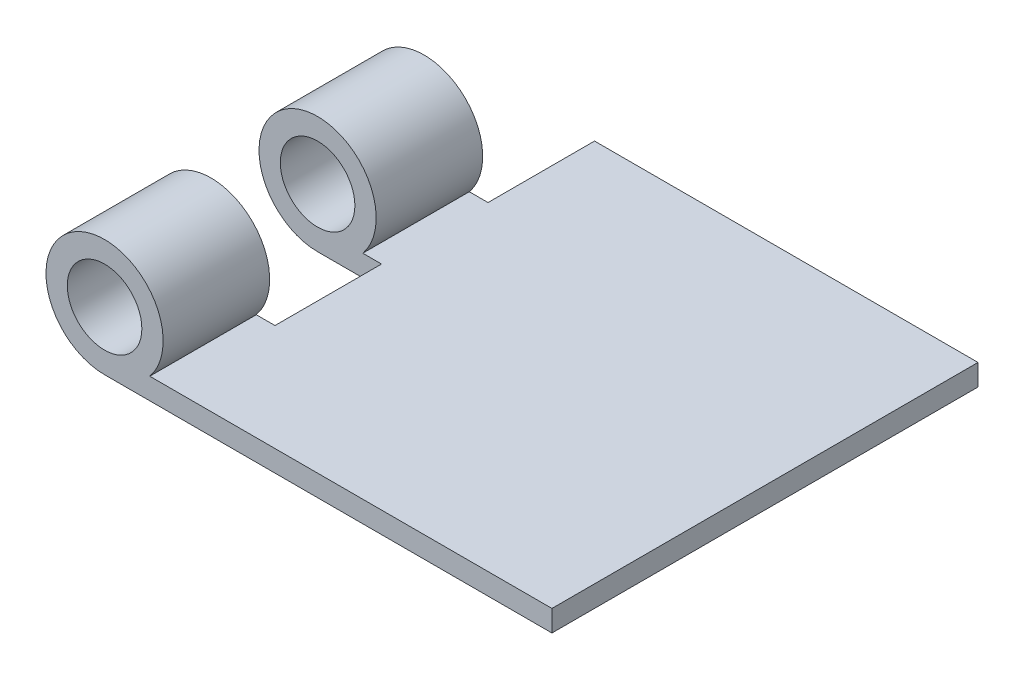
ISO-10303-21;
HEADER;
FILE_DESCRIPTION(('STEP AP214'),'2;1');
FILE_NAME('part.step','',(''),(''),'','','');
FILE_SCHEMA(('AUTOMOTIVE_DESIGN { 1 0 10303 214 1 1 1 1 }'));
ENDSEC;
DATA;
#1=APPLICATION_CONTEXT('core data for automotive mechanical design processes');
#2=APPLICATION_PROTOCOL_DEFINITION('international standard','automotive_design',2000,#1);
#3=PRODUCT_CONTEXT('',#1,'mechanical');
#4=PRODUCT('Part','Part','',(#3));
#5=PRODUCT_RELATED_PRODUCT_CATEGORY('part','',(#4));
#6=PRODUCT_DEFINITION_FORMATION('','',#4);
#7=PRODUCT_DEFINITION_CONTEXT('part definition',#1,'design');
#8=PRODUCT_DEFINITION('design','',#6,#7);
#9=PRODUCT_DEFINITION_SHAPE('','',#8);
#10=(LENGTH_UNIT() NAMED_UNIT(*) SI_UNIT(.MILLI.,.METRE.));
#11=(NAMED_UNIT(*) PLANE_ANGLE_UNIT() SI_UNIT($,.RADIAN.));
#12=(NAMED_UNIT(*) SI_UNIT($,.STERADIAN.) SOLID_ANGLE_UNIT());
#13=UNCERTAINTY_MEASURE_WITH_UNIT(LENGTH_MEASURE(1.E-05),#10,'distance_accuracy_value','');
#14=(GEOMETRIC_REPRESENTATION_CONTEXT(3) GLOBAL_UNCERTAINTY_ASSIGNED_CONTEXT((#13)) GLOBAL_UNIT_ASSIGNED_CONTEXT((#10,
#11,#12)) REPRESENTATION_CONTEXT('',''));
#15=CARTESIAN_POINT('',(0.,0.,0.));
#16=DIRECTION('',(0.,0.,1.));
#17=DIRECTION('',(1.,0.,0.));
#18=AXIS2_PLACEMENT_3D('',#15,#16,#17);
#19=CARTESIAN_POINT('',(18.,-1.,-10.));
#20=DIRECTION('',(0.,0.,-1.));
#21=DIRECTION('',(-1.,0.,0.));
#22=AXIS2_PLACEMENT_3D('',#19,#20,#21);
#23=PLANE('',#22);
#24=DIRECTION('',(-1.,0.,0.));
#25=VECTOR('',#24,1.);
#26=CARTESIAN_POINT('',(18.,0.,-10.));
#27=LINE('',#26,#25);
#28=CARTESIAN_POINT('',(36.,0.,-10.));
#29=VERTEX_POINT('',#28);
#30=CARTESIAN_POINT('',(18.,0.,-10.));
#31=VERTEX_POINT('',#30);
#32=EDGE_CURVE('E147',#29,#31,#27,.T.);
#33=ORIENTED_EDGE('',*,*,#32,.F.);
#34=DIRECTION('',(0.,1.,0.));
#35=VECTOR('',#34,1.);
#36=CARTESIAN_POINT('',(36.,-1.,-10.));
#37=LINE('',#36,#35);
#38=CARTESIAN_POINT('',(36.,-1.,-10.));
#39=VERTEX_POINT('',#38);
#40=EDGE_CURVE('E191',#39,#29,#37,.T.);
#41=ORIENTED_EDGE('',*,*,#40,.F.);
#42=DIRECTION('',(-1.,0.,0.));
#43=VECTOR('',#42,1.);
#44=CARTESIAN_POINT('',(18.,-1.,-10.));
#45=LINE('',#44,#43);
#46=CARTESIAN_POINT('',(18.,-1.,-10.));
#47=VERTEX_POINT('',#46);
#48=EDGE_CURVE('E150',#39,#47,#45,.T.);
#49=ORIENTED_EDGE('',*,*,#48,.T.);
#50=DIRECTION('',(0.,1.,0.));
#51=VECTOR('',#50,1.);
#52=CARTESIAN_POINT('',(18.,-1.,-10.));
#53=LINE('',#52,#51);
#54=EDGE_CURVE('E178',#47,#31,#53,.T.);
#55=ORIENTED_EDGE('',*,*,#54,.T.);
#56=EDGE_LOOP('',(#33,#41,#49,#55));
#57=FACE_BOUND('',#56,.T.);
#58=ADVANCED_FACE('F36',(#57),#23,.T.);
#59=CARTESIAN_POINT('',(36.,-1.,-10.));
#60=DIRECTION('',(1.,0.,0.));
#61=DIRECTION('',(0.,0.,-1.));
#62=AXIS2_PLACEMENT_3D('',#59,#60,#61);
#63=PLANE('',#62);
#64=DIRECTION('',(0.,0.,-1.));
#65=VECTOR('',#64,1.);
#66=CARTESIAN_POINT('',(36.,0.,-10.));
#67=LINE('',#66,#65);
#68=CARTESIAN_POINT('',(36.,0.,9.99999999999999));
#69=VERTEX_POINT('',#68);
#70=EDGE_CURVE('E154',#69,#29,#67,.T.);
#71=ORIENTED_EDGE('',*,*,#70,.F.);
#72=DIRECTION('',(0.,1.,0.));
#73=VECTOR('',#72,1.);
#74=CARTESIAN_POINT('',(36.,-1.,9.99999999999999));
#75=LINE('',#74,#73);
#76=CARTESIAN_POINT('',(36.,-1.,9.99999999999999));
#77=VERTEX_POINT('',#76);
#78=EDGE_CURVE('E193',#77,#69,#75,.T.);
#79=ORIENTED_EDGE('',*,*,#78,.F.);
#80=DIRECTION('',(0.,0.,-1.));
#81=VECTOR('',#80,1.);
#82=CARTESIAN_POINT('',(36.,-1.,-10.));
#83=LINE('',#82,#81);
#84=EDGE_CURVE('E175',#77,#39,#83,.T.);
#85=ORIENTED_EDGE('',*,*,#84,.T.);
#86=ORIENTED_EDGE('',*,*,#40,.T.);
#87=EDGE_LOOP('',(#71,#79,#85,#86));
#88=FACE_BOUND('',#87,.T.);
#89=ADVANCED_FACE('F210',(#88),#63,.T.);
#90=CARTESIAN_POINT('',(36.,-1.,9.99999999999999));
#91=DIRECTION('',(0.,0.,1.));
#92=DIRECTION('',(1.,0.,0.));
#93=AXIS2_PLACEMENT_3D('',#90,#91,#92);
#94=PLANE('',#93);
#95=DIRECTION('',(1.,0.,0.));
#96=VECTOR('',#95,1.);
#97=CARTESIAN_POINT('',(36.,0.,9.99999999999999));
#98=LINE('',#97,#96);
#99=CARTESIAN_POINT('',(17.1213203435596,0.,9.99999999999999));
#100=VERTEX_POINT('',#99);
#101=EDGE_CURVE('E187',#100,#69,#98,.T.);
#102=ORIENTED_EDGE('',*,*,#101,.F.);
#103=CARTESIAN_POINT('',(15.,1.75,10.));
#104=DIRECTION('',(0.,0.,1.));
#105=DIRECTION('',(1.,0.,0.));
#106=AXIS2_PLACEMENT_3D('',#103,#104,#105);
#107=CIRCLE('',#106,2.75);
#108=CARTESIAN_POINT('',(15.,-1.,10.));
#109=VERTEX_POINT('',#108);
#110=EDGE_CURVE('E137',#100,#109,#107,.T.);
#111=ORIENTED_EDGE('',*,*,#110,.T.);
#112=DIRECTION('',(1.,0.,0.));
#113=VECTOR('',#112,1.);
#114=CARTESIAN_POINT('',(36.,-1.,9.99999999999999));
#115=LINE('',#114,#113);
#116=EDGE_CURVE('E172',#109,#77,#115,.T.);
#117=ORIENTED_EDGE('',*,*,#116,.T.);
#118=ORIENTED_EDGE('',*,*,#78,.T.);
#119=EDGE_LOOP('',(#102,#111,#117,#118));
#120=FACE_BOUND('',#119,.T.);
#121=CARTESIAN_POINT('',(15.,1.75,10.));
#122=DIRECTION('',(0.,0.,1.));
#123=DIRECTION('',(1.,0.,0.));
#124=AXIS2_PLACEMENT_3D('',#121,#122,#123);
#125=CIRCLE('',#124,1.75);
#126=CARTESIAN_POINT('',(16.75,1.75,10.));
#127=VERTEX_POINT('',#126);
#128=EDGE_CURVE('E141',#127,#127,#125,.T.);
#129=ORIENTED_EDGE('',*,*,#128,.F.);
#130=EDGE_LOOP('',(#129));
#131=FACE_BOUND('',#130,.T.);
#132=ADVANCED_FACE('F235',(#120,#131),#94,.T.);
#133=CARTESIAN_POINT('',(18.,-1.,4.99999999999999));
#134=DIRECTION('',(0.,0.,-1.));
#135=DIRECTION('',(-1.,0.,0.));
#136=AXIS2_PLACEMENT_3D('',#133,#134,#135);
#137=PLANE('',#136);
#138=CARTESIAN_POINT('',(15.,1.75,4.99999999999999));
#139=DIRECTION('',(0.,0.,-1.));
#140=DIRECTION('',(-1.,0.,0.));
#141=AXIS2_PLACEMENT_3D('',#138,#139,#140);
#142=CIRCLE('',#141,1.75);
#143=CARTESIAN_POINT('',(13.25,1.75,4.99999999999999));
#144=VERTEX_POINT('',#143);
#145=EDGE_CURVE('E140',#144,#144,#142,.F.);
#146=ORIENTED_EDGE('',*,*,#145,.T.);
#147=EDGE_LOOP('',(#146));
#148=FACE_BOUND('',#147,.T.);
#149=DIRECTION('',(-1.,0.,0.));
#150=VECTOR('',#149,1.);
#151=CARTESIAN_POINT('',(18.,-1.,4.99999999999999));
#152=LINE('',#151,#150);
#153=CARTESIAN_POINT('',(18.,-1.,4.99999999999999));
#154=VERTEX_POINT('',#153);
#155=CARTESIAN_POINT('',(15.,-1.,4.99999999999999));
#156=VERTEX_POINT('',#155);
#157=EDGE_CURVE('E166',#154,#156,#152,.T.);
#158=ORIENTED_EDGE('',*,*,#157,.T.);
#159=CARTESIAN_POINT('',(15.,1.75,4.99999999999999));
#160=DIRECTION('',(0.,0.,-1.));
#161=DIRECTION('',(-1.,0.,0.));
#162=AXIS2_PLACEMENT_3D('',#159,#160,#161);
#163=CIRCLE('',#162,2.75);
#164=CARTESIAN_POINT('',(17.1213203435596,0.,4.99999999999999));
#165=VERTEX_POINT('',#164);
#166=EDGE_CURVE('E144',#165,#156,#163,.F.);
#167=ORIENTED_EDGE('',*,*,#166,.F.);
#168=DIRECTION('',(-1.,0.,0.));
#169=VECTOR('',#168,1.);
#170=CARTESIAN_POINT('',(18.,0.,4.99999999999999));
#171=LINE('',#170,#169);
#172=CARTESIAN_POINT('',(18.,0.,4.99999999999999));
#173=VERTEX_POINT('',#172);
#174=EDGE_CURVE('E185',#173,#165,#171,.T.);
#175=ORIENTED_EDGE('',*,*,#174,.F.);
#176=DIRECTION('',(0.,1.,0.));
#177=VECTOR('',#176,1.);
#178=CARTESIAN_POINT('',(18.,-1.,4.99999999999999));
#179=LINE('',#178,#177);
#180=EDGE_CURVE('E196',#154,#173,#179,.T.);
#181=ORIENTED_EDGE('',*,*,#180,.F.);
#182=EDGE_LOOP('',(#158,#167,#175,#181));
#183=FACE_BOUND('',#182,.T.);
#184=ADVANCED_FACE('F240',(#148,#183),#137,.T.);
#185=CARTESIAN_POINT('',(18.,-1.,0.));
#186=DIRECTION('',(-1.,0.,0.));
#187=DIRECTION('',(0.,0.,1.));
#188=AXIS2_PLACEMENT_3D('',#185,#186,#187);
#189=PLANE('',#188);
#190=DIRECTION('',(0.,0.,1.));
#191=VECTOR('',#190,1.);
#192=CARTESIAN_POINT('',(18.,0.,0.));
#193=LINE('',#192,#191);
#194=CARTESIAN_POINT('',(18.,0.,0.));
#195=VERTEX_POINT('',#194);
#196=EDGE_CURVE('E120',#195,#173,#193,.T.);
#197=ORIENTED_EDGE('',*,*,#196,.F.);
#198=DIRECTION('',(0.,1.,0.));
#199=VECTOR('',#198,1.);
#200=CARTESIAN_POINT('',(18.,-1.,0.));
#201=LINE('',#200,#199);
#202=CARTESIAN_POINT('',(18.,-1.,0.));
#203=VERTEX_POINT('',#202);
#204=EDGE_CURVE('E117',#203,#195,#201,.T.);
#205=ORIENTED_EDGE('',*,*,#204,.F.);
#206=DIRECTION('',(0.,0.,1.));
#207=VECTOR('',#206,1.);
#208=CARTESIAN_POINT('',(18.,-1.,0.));
#209=LINE('',#208,#207);
#210=EDGE_CURVE('E163',#203,#154,#209,.T.);
#211=ORIENTED_EDGE('',*,*,#210,.T.);
#212=ORIENTED_EDGE('',*,*,#180,.T.);
#213=EDGE_LOOP('',(#197,#205,#211,#212));
#214=FACE_BOUND('',#213,.T.);
#215=ADVANCED_FACE('F248',(#214),#189,.T.);
#216=CARTESIAN_POINT('',(15.,-1.,0.));
#217=DIRECTION('',(0.,0.,1.));
#218=DIRECTION('',(1.,0.,0.));
#219=AXIS2_PLACEMENT_3D('',#216,#217,#218);
#220=PLANE('',#219);
#221=DIRECTION('',(1.,0.,0.));
#222=VECTOR('',#221,1.);
#223=CARTESIAN_POINT('',(15.,0.,0.));
#224=LINE('',#223,#222);
#225=CARTESIAN_POINT('',(17.1213203435596,0.,0.));
#226=VERTEX_POINT('',#225);
#227=EDGE_CURVE('E111',#226,#195,#224,.T.);
#228=ORIENTED_EDGE('',*,*,#227,.F.);
#229=CARTESIAN_POINT('',(15.,1.75,0.));
#230=DIRECTION('',(0.,0.,1.));
#231=DIRECTION('',(1.,0.,0.));
#232=AXIS2_PLACEMENT_3D('',#229,#230,#231);
#233=CIRCLE('',#232,2.75);
#234=CARTESIAN_POINT('',(15.,-1.,0.));
#235=VERTEX_POINT('',#234);
#236=EDGE_CURVE('E116',#235,#226,#233,.F.);
#237=ORIENTED_EDGE('',*,*,#236,.F.);
#238=DIRECTION('',(1.,0.,0.));
#239=VECTOR('',#238,1.);
#240=CARTESIAN_POINT('',(15.,-1.,0.));
#241=LINE('',#240,#239);
#242=EDGE_CURVE('E161',#235,#203,#241,.T.);
#243=ORIENTED_EDGE('',*,*,#242,.T.);
#244=ORIENTED_EDGE('',*,*,#204,.T.);
#245=EDGE_LOOP('',(#228,#237,#243,#244));
#246=FACE_BOUND('',#245,.T.);
#247=CARTESIAN_POINT('',(15.,1.75,0.));
#248=DIRECTION('',(0.,0.,1.));
#249=DIRECTION('',(1.,0.,0.));
#250=AXIS2_PLACEMENT_3D('',#247,#248,#249);
#251=CIRCLE('',#250,1.75);
#252=CARTESIAN_POINT('',(16.75,1.75,0.));
#253=VERTEX_POINT('',#252);
#254=EDGE_CURVE('E136',#253,#253,#251,.F.);
#255=ORIENTED_EDGE('',*,*,#254,.T.);
#256=EDGE_LOOP('',(#255));
#257=FACE_BOUND('',#256,.T.);
#258=ADVANCED_FACE('F112',(#246,#257),#220,.T.);
#259=CARTESIAN_POINT('',(18.,-1.,-5.00000000000001));
#260=DIRECTION('',(0.,0.,-1.));
#261=DIRECTION('',(-1.,0.,0.));
#262=AXIS2_PLACEMENT_3D('',#259,#260,#261);
#263=PLANE('',#262);
#264=CARTESIAN_POINT('',(15.,1.75,-5.00000000000001));
#265=DIRECTION('',(0.,0.,-1.));
#266=DIRECTION('',(-1.,0.,0.));
#267=AXIS2_PLACEMENT_3D('',#264,#265,#266);
#268=CIRCLE('',#267,1.75);
#269=CARTESIAN_POINT('',(13.25,1.75,-5.00000000000001));
#270=VERTEX_POINT('',#269);
#271=EDGE_CURVE('E129',#270,#270,#268,.T.);
#272=ORIENTED_EDGE('',*,*,#271,.F.);
#273=EDGE_LOOP('',(#272));
#274=FACE_BOUND('',#273,.T.);
#275=DIRECTION('',(-1.,0.,0.));
#276=VECTOR('',#275,1.);
#277=CARTESIAN_POINT('',(18.,-1.,-5.00000000000001));
#278=LINE('',#277,#276);
#279=CARTESIAN_POINT('',(18.,-1.,-5.00000000000001));
#280=VERTEX_POINT('',#279);
#281=CARTESIAN_POINT('',(15.,-1.,-5.00000000000001));
#282=VERTEX_POINT('',#281);
#283=EDGE_CURVE('E157',#280,#282,#278,.T.);
#284=ORIENTED_EDGE('',*,*,#283,.T.);
#285=CARTESIAN_POINT('',(15.,1.75,-5.00000000000001));
#286=DIRECTION('',(0.,0.,-1.));
#287=DIRECTION('',(-1.,0.,0.));
#288=AXIS2_PLACEMENT_3D('',#285,#286,#287);
#289=CIRCLE('',#288,2.75);
#290=CARTESIAN_POINT('',(17.1213203435596,0.,-5.00000000000001));
#291=VERTEX_POINT('',#290);
#292=EDGE_CURVE('E132',#282,#291,#289,.T.);
#293=ORIENTED_EDGE('',*,*,#292,.T.);
#294=DIRECTION('',(-1.,0.,0.));
#295=VECTOR('',#294,1.);
#296=CARTESIAN_POINT('',(18.,0.,-5.00000000000001));
#297=LINE('',#296,#295);
#298=CARTESIAN_POINT('',(18.,0.,-5.00000000000001));
#299=VERTEX_POINT('',#298);
#300=EDGE_CURVE('E49',#299,#291,#297,.T.);
#301=ORIENTED_EDGE('',*,*,#300,.F.);
#302=DIRECTION('',(0.,1.,0.));
#303=VECTOR('',#302,1.);
#304=CARTESIAN_POINT('',(18.,-1.,-5.00000000000001));
#305=LINE('',#304,#303);
#306=EDGE_CURVE('E199',#280,#299,#305,.T.);
#307=ORIENTED_EDGE('',*,*,#306,.F.);
#308=EDGE_LOOP('',(#284,#293,#301,#307));
#309=FACE_BOUND('',#308,.T.);
#310=ADVANCED_FACE('F216',(#274,#309),#263,.T.);
#311=CARTESIAN_POINT('',(18.,-1.,-10.));
#312=DIRECTION('',(-1.,0.,0.));
#313=DIRECTION('',(0.,0.,1.));
#314=AXIS2_PLACEMENT_3D('',#311,#312,#313);
#315=PLANE('',#314);
#316=DIRECTION('',(0.,0.,1.));
#317=VECTOR('',#316,1.);
#318=CARTESIAN_POINT('',(18.,0.,-10.));
#319=LINE('',#318,#317);
#320=EDGE_CURVE('E181',#31,#299,#319,.T.);
#321=ORIENTED_EDGE('',*,*,#320,.F.);
#322=ORIENTED_EDGE('',*,*,#54,.F.);
#323=DIRECTION('',(0.,0.,1.));
#324=VECTOR('',#323,1.);
#325=CARTESIAN_POINT('',(18.,-1.,-10.));
#326=LINE('',#325,#324);
#327=EDGE_CURVE('E153',#47,#280,#326,.T.);
#328=ORIENTED_EDGE('',*,*,#327,.T.);
#329=ORIENTED_EDGE('',*,*,#306,.T.);
#330=EDGE_LOOP('',(#321,#322,#328,#329));
#331=FACE_BOUND('',#330,.T.);
#332=ADVANCED_FACE('F207',(#331),#315,.T.);
#333=CARTESIAN_POINT('',(0.,-1.,0.));
#334=DIRECTION('',(0.,-1.,0.));
#335=DIRECTION('',(0.,0.,-1.));
#336=AXIS2_PLACEMENT_3D('',#333,#334,#335);
#337=PLANE('',#336);
#338=ORIENTED_EDGE('',*,*,#48,.F.);
#339=ORIENTED_EDGE('',*,*,#84,.F.);
#340=ORIENTED_EDGE('',*,*,#116,.F.);
#341=DIRECTION('',(0.,0.,1.));
#342=VECTOR('',#341,1.);
#343=CARTESIAN_POINT('',(15.,-1.,4.99999999999999));
#344=LINE('',#343,#342);
#345=EDGE_CURVE('E169',#156,#109,#344,.T.);
#346=ORIENTED_EDGE('',*,*,#345,.F.);
#347=ORIENTED_EDGE('',*,*,#157,.F.);
#348=ORIENTED_EDGE('',*,*,#210,.F.);
#349=ORIENTED_EDGE('',*,*,#242,.F.);
#350=DIRECTION('',(0.,0.,1.));
#351=VECTOR('',#350,1.);
#352=CARTESIAN_POINT('',(15.,-1.,-5.00000000000001));
#353=LINE('',#352,#351);
#354=EDGE_CURVE('E128',#282,#235,#353,.T.);
#355=ORIENTED_EDGE('',*,*,#354,.F.);
#356=ORIENTED_EDGE('',*,*,#283,.F.);
#357=ORIENTED_EDGE('',*,*,#327,.F.);
#358=EDGE_LOOP('',(#338,#339,#340,#346,#347,#348,#349,#355,#356,#357));
#359=FACE_BOUND('',#358,.T.);
#360=ADVANCED_FACE('F213',(#359),#337,.T.);
#361=CARTESIAN_POINT('',(0.,0.,0.));
#362=DIRECTION('',(0.,-1.,0.));
#363=DIRECTION('',(0.,0.,-1.));
#364=AXIS2_PLACEMENT_3D('',#361,#362,#363);
#365=PLANE('',#364);
#366=ORIENTED_EDGE('',*,*,#300,.T.);
#367=DIRECTION('',(0.,0.,-1.));
#368=VECTOR('',#367,1.);
#369=CARTESIAN_POINT('',(17.1213203435596,0.,7.77817459305202));
#370=LINE('',#369,#368);
#371=EDGE_CURVE('E11',#291,#226,#370,.F.);
#372=ORIENTED_EDGE('',*,*,#371,.T.);
#373=ORIENTED_EDGE('',*,*,#227,.T.);
#374=ORIENTED_EDGE('',*,*,#196,.T.);
#375=ORIENTED_EDGE('',*,*,#174,.T.);
#376=DIRECTION('',(0.,0.,1.));
#377=VECTOR('',#376,1.);
#378=CARTESIAN_POINT('',(17.1213203435596,0.,-2.77817459305203));
#379=LINE('',#378,#377);
#380=EDGE_CURVE('E43',#165,#100,#379,.T.);
#381=ORIENTED_EDGE('',*,*,#380,.T.);
#382=ORIENTED_EDGE('',*,*,#101,.T.);
#383=ORIENTED_EDGE('',*,*,#70,.T.);
#384=ORIENTED_EDGE('',*,*,#32,.T.);
#385=ORIENTED_EDGE('',*,*,#320,.T.);
#386=EDGE_LOOP('',(#366,#372,#373,#374,#375,#381,#382,#383,#384,#385));
#387=FACE_BOUND('',#386,.T.);
#388=ADVANCED_FACE('F122',(#387),#365,.F.);
#389=CARTESIAN_POINT('',(15.,1.75,-2.77817459305203));
#390=DIRECTION('',(0.,0.,1.));
#391=DIRECTION('',(1.,0.,0.));
#392=AXIS2_PLACEMENT_3D('',#389,#390,#391);
#393=CYLINDRICAL_SURFACE('',#392,2.75);
#394=ORIENTED_EDGE('',*,*,#166,.T.);
#395=ORIENTED_EDGE('',*,*,#345,.T.);
#396=ORIENTED_EDGE('',*,*,#110,.F.);
#397=ORIENTED_EDGE('',*,*,#380,.F.);
#398=EDGE_LOOP('',(#394,#395,#396,#397));
#399=FACE_BOUND('',#398,.T.);
#400=ADVANCED_FACE('F264',(#399),#393,.T.);
#401=CARTESIAN_POINT('',(15.,1.75,-2.77817459305203));
#402=DIRECTION('',(0.,0.,1.));
#403=DIRECTION('',(1.,0.,0.));
#404=AXIS2_PLACEMENT_3D('',#401,#402,#403);
#405=CYLINDRICAL_SURFACE('',#404,1.75);
#406=ORIENTED_EDGE('',*,*,#128,.T.);
#407=EDGE_LOOP('',(#406));
#408=FACE_BOUND('',#407,.T.);
#409=ORIENTED_EDGE('',*,*,#145,.F.);
#410=EDGE_LOOP('',(#409));
#411=FACE_BOUND('',#410,.T.);
#412=ADVANCED_FACE('F228',(#408,#411),#405,.F.);
#413=CARTESIAN_POINT('',(15.,1.75,7.77817459305202));
#414=DIRECTION('',(0.,0.,-1.));
#415=DIRECTION('',(-1.,0.,0.));
#416=AXIS2_PLACEMENT_3D('',#413,#414,#415);
#417=CYLINDRICAL_SURFACE('',#416,2.75);
#418=ORIENTED_EDGE('',*,*,#354,.T.);
#419=ORIENTED_EDGE('',*,*,#236,.T.);
#420=ORIENTED_EDGE('',*,*,#371,.F.);
#421=ORIENTED_EDGE('',*,*,#292,.F.);
#422=EDGE_LOOP('',(#418,#419,#420,#421));
#423=FACE_BOUND('',#422,.T.);
#424=ADVANCED_FACE('F127',(#423),#417,.T.);
#425=CARTESIAN_POINT('',(15.,1.75,7.77817459305202));
#426=DIRECTION('',(0.,0.,-1.));
#427=DIRECTION('',(-1.,0.,0.));
#428=AXIS2_PLACEMENT_3D('',#425,#426,#427);
#429=CYLINDRICAL_SURFACE('',#428,1.75);
#430=ORIENTED_EDGE('',*,*,#271,.T.);
#431=EDGE_LOOP('',(#430));
#432=FACE_BOUND('',#431,.T.);
#433=ORIENTED_EDGE('',*,*,#254,.F.);
#434=EDGE_LOOP('',(#433));
#435=FACE_BOUND('',#434,.T.);
#436=ADVANCED_FACE('F221',(#432,#435),#429,.F.);
#437=CLOSED_SHELL('',(#58,#89,#132,#184,#215,#258,#310,#332,#360,#388,#400,#412,#424,#436));
#438=MANIFOLD_SOLID_BREP('B2',#437);
#439=ADVANCED_BREP_SHAPE_REPRESENTATION('',(#18,#438),#14);
#440=SHAPE_DEFINITION_REPRESENTATION(#9,#439);
ENDSEC;
END-ISO-10303-21;
